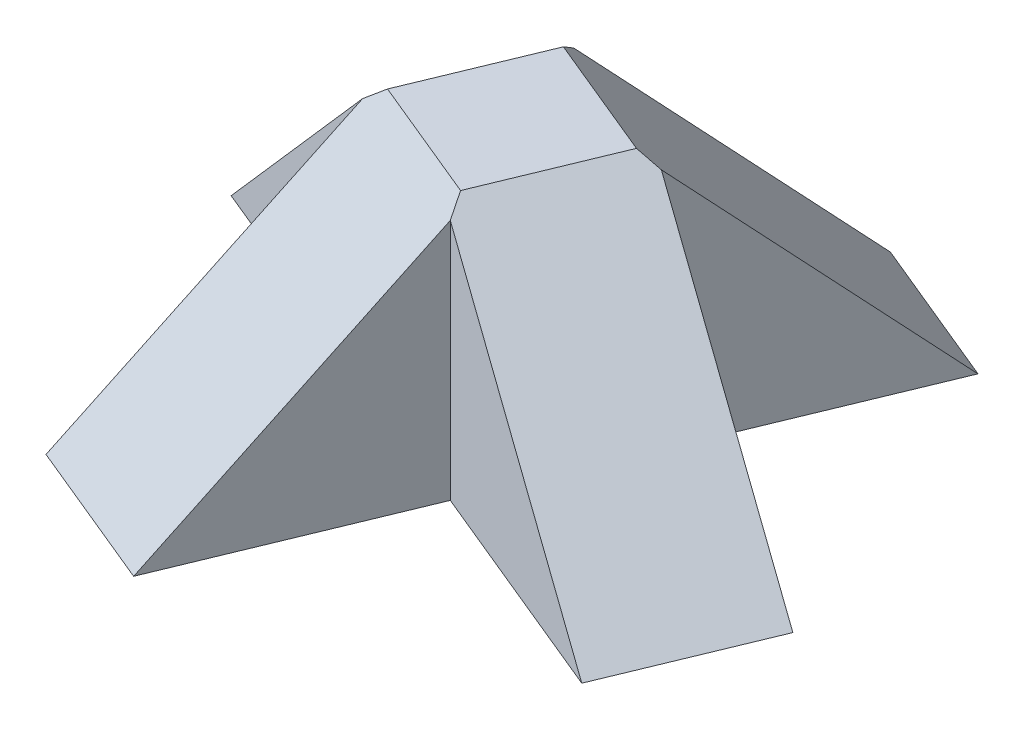
ISO-10303-21;
HEADER;
FILE_DESCRIPTION(('STEP AP214'),'2;1');
FILE_NAME('part.step','',(''),(''),'','','');
FILE_SCHEMA(('AUTOMOTIVE_DESIGN { 1 0 10303 214 1 1 1 1 }'));
ENDSEC;
DATA;
#1=APPLICATION_CONTEXT('core data for automotive mechanical design processes');
#2=APPLICATION_PROTOCOL_DEFINITION('international standard','automotive_design',2000,#1);
#3=PRODUCT_CONTEXT('',#1,'mechanical');
#4=PRODUCT('Part','Part','',(#3));
#5=PRODUCT_RELATED_PRODUCT_CATEGORY('part','',(#4));
#6=PRODUCT_DEFINITION_FORMATION('','',#4);
#7=PRODUCT_DEFINITION_CONTEXT('part definition',#1,'design');
#8=PRODUCT_DEFINITION('design','',#6,#7);
#9=PRODUCT_DEFINITION_SHAPE('','',#8);
#10=(LENGTH_UNIT() NAMED_UNIT(*) SI_UNIT(.MILLI.,.METRE.));
#11=(NAMED_UNIT(*) PLANE_ANGLE_UNIT() SI_UNIT($,.RADIAN.));
#12=(NAMED_UNIT(*) SI_UNIT($,.STERADIAN.) SOLID_ANGLE_UNIT());
#13=UNCERTAINTY_MEASURE_WITH_UNIT(LENGTH_MEASURE(1.E-05),#10,'distance_accuracy_value','');
#14=(GEOMETRIC_REPRESENTATION_CONTEXT(3) GLOBAL_UNCERTAINTY_ASSIGNED_CONTEXT((#13)) GLOBAL_UNIT_ASSIGNED_CONTEXT((#10,
#11,#12)) REPRESENTATION_CONTEXT('',''));
#15=CARTESIAN_POINT('',(0.,0.,0.));
#16=DIRECTION('',(0.,0.,1.));
#17=DIRECTION('',(1.,0.,0.));
#18=AXIS2_PLACEMENT_3D('',#15,#16,#17);
#19=CARTESIAN_POINT('',(93.,-98.95,36.));
#20=DIRECTION('',(0.,1.,0.));
#21=DIRECTION('',(0.,0.,1.));
#22=AXIS2_PLACEMENT_3D('',#19,#20,#21);
#23=PLANE('',#22);
#24=DIRECTION('',(0.924224592734063,-5.10702591323219E-12,0.381849318692014));
#25=VECTOR('',#24,1.);
#26=CARTESIAN_POINT('',(92.6734815221411,-98.9500000000028,36.1355938185074));
#27=LINE('',#26,#25);
#28=CARTESIAN_POINT('',(92.6734815221428,-98.9500000000034,36.1355938185104));
#29=VERTEX_POINT('',#28);
#30=CARTESIAN_POINT('',(93.1355938185099,-98.9500000000021,36.3265184778585));
#31=VERTEX_POINT('',#30);
#32=EDGE_CURVE('E110',#29,#31,#27,.T.);
#33=ORIENTED_EDGE('',*,*,#32,.T.);
#34=DIRECTION('',(-0.381849318692078,5.07927033761673E-12,0.924224592734037));
#35=VECTOR('',#34,1.);
#36=CARTESIAN_POINT('',(93.3265184778551,-98.9500000000054,35.864406181488));
#37=LINE('',#36,#35);
#38=CARTESIAN_POINT('',(93.3265184778585,-98.950000000002,35.8644061814901));
#39=VERTEX_POINT('',#38);
#40=EDGE_CURVE('E20',#39,#31,#37,.T.);
#41=ORIENTED_EDGE('',*,*,#40,.F.);
#42=DIRECTION('',(0.924224592734062,5.10702591323204E-12,0.381849318692016));
#43=VECTOR('',#42,1.);
#44=CARTESIAN_POINT('',(92.864406181488,-98.9500000000054,35.673481522145));
#45=LINE('',#44,#43);
#46=CARTESIAN_POINT('',(92.8644061814896,-98.9500000000034,35.6734815221428));
#47=VERTEX_POINT('',#46);
#48=EDGE_CURVE('E96',#47,#39,#45,.T.);
#49=ORIENTED_EDGE('',*,*,#48,.F.);
#50=DIRECTION('',(-0.381849318692083,-5.05151476200141E-12,0.924224592734035));
#51=VECTOR('',#50,1.);
#52=CARTESIAN_POINT('',(92.8644061814926,-98.9500000000028,35.6734815221411));
#53=LINE('',#52,#51);
#54=EDGE_CURVE('E161',#47,#29,#53,.T.);
#55=ORIENTED_EDGE('',*,*,#54,.T.);
#56=EDGE_LOOP('',(#33,#41,#49,#55));
#57=FACE_BOUND('',#56,.T.);
#58=ADVANCED_FACE('F17',(#57),#23,.T.);
#59=CARTESIAN_POINT('',(93.67006282973,-99.425,36.27684075605));
#60=DIRECTION('',(0.653525476860657,0.707106781189053,0.270008242634382));
#61=DIRECTION('',(-0.734383235407128,0.67873504665146,0.));
#62=AXIS2_PLACEMENT_3D('',#59,#60,#61);
#63=PLANE('',#62);
#64=DIRECTION('',(0.381849318684862,0.,-0.924224592737018));
#65=VECTOR('',#64,1.);
#66=CARTESIAN_POINT('',(93.99451471568,-99.9,36.73548656024));
#67=LINE('',#66,#65);
#68=CARTESIAN_POINT('',(93.9945147156802,-99.9,36.7354865602396));
#69=VERTEX_POINT('',#68);
#70=CARTESIAN_POINT('',(94.2236243068905,-99.8999999999996,36.1809518045998));
#71=VERTEX_POINT('',#70);
#72=EDGE_CURVE('E137',#69,#71,#67,.T.);
#73=ORIENTED_EDGE('',*,*,#72,.T.);
#74=DIRECTION('',(-0.653525476861279,0.707106781188705,-0.270008242633788));
#75=VECTOR('',#74,1.);
#76=CARTESIAN_POINT('',(94.2236243068906,-99.9,36.1809518045986));
#77=LINE('',#76,#75);
#78=CARTESIAN_POINT('',(93.3918221734289,-99.0000000000014,35.8372874177856));
#79=VERTEX_POINT('',#78);
#80=EDGE_CURVE('E91',#71,#79,#77,.T.);
#81=ORIENTED_EDGE('',*,*,#80,.T.);
#82=DIRECTION('',(0.754062124349384,-0.577350269182957,-0.313140510467844));
#83=VECTOR('',#82,1.);
#84=CARTESIAN_POINT('',(93.3265184778589,-98.9500000000028,35.8644061814926));
#85=LINE('',#84,#83);
#86=EDGE_CURVE('E100',#39,#79,#85,.T.);
#87=ORIENTED_EDGE('',*,*,#86,.F.);
#88=ORIENTED_EDGE('',*,*,#40,.T.);
#89=DIRECTION('',(0.313140510450641,-0.577350269197594,0.75406212434532));
#90=VECTOR('',#89,1.);
#91=CARTESIAN_POINT('',(93.135593818512,-98.9500000000054,36.326518477855));
#92=LINE('',#91,#90);
#93=CARTESIAN_POINT('',(93.162712582211,-99.0000000000027,36.3918221734261));
#94=VERTEX_POINT('',#93);
#95=EDGE_CURVE('E147',#31,#94,#92,.T.);
#96=ORIENTED_EDGE('',*,*,#95,.T.);
#97=DIRECTION('',(-0.653525476864632,0.707106781185078,-0.270008242635173));
#98=VECTOR('',#97,1.);
#99=CARTESIAN_POINT('',(93.9945147156806,-99.9,36.7354865602386));
#100=LINE('',#99,#98);
#101=EDGE_CURVE('E139',#69,#94,#100,.T.);
#102=ORIENTED_EDGE('',*,*,#101,.F.);
#103=EDGE_LOOP('',(#73,#81,#87,#88,#96,#102));
#104=FACE_BOUND('',#103,.T.);
#105=ADVANCED_FACE('F112',(#104),#63,.T.);
#106=CARTESIAN_POINT('',(93.80772324016,-99.45,36.00911961119));
#107=DIRECTION('',(-0.381849318686394,0.,0.924224592736385));
#108=DIRECTION('',(0.924224592736385,0.,0.381849318686394));
#109=AXIS2_PLACEMENT_3D('',#106,#107,#108);
#110=PLANE('',#109);
#111=DIRECTION('',(0.,1.,0.));
#112=VECTOR('',#111,1.);
#113=CARTESIAN_POINT('',(93.3918221734194,-99.45,35.8372874177856));
#114=LINE('',#113,#112);
#115=CARTESIAN_POINT('',(93.3918221734288,-99.9,35.8372874177853));
#116=VERTEX_POINT('',#115);
#117=EDGE_CURVE('E106',#79,#116,#114,.F.);
#118=ORIENTED_EDGE('',*,*,#117,.F.);
#119=ORIENTED_EDGE('',*,*,#80,.F.);
#120=DIRECTION('',(-0.92422459273898,0.,-0.381849318680112));
#121=VECTOR('',#120,1.);
#122=CARTESIAN_POINT('',(94.22362430689,-99.9,36.1809518046));
#123=LINE('',#122,#121);
#124=EDGE_CURVE('E132',#71,#116,#123,.T.);
#125=ORIENTED_EDGE('',*,*,#124,.T.);
#126=EDGE_LOOP('',(#118,#119,#125));
#127=FACE_BOUND('',#126,.T.);
#128=ADVANCED_FACE('F136',(#127),#110,.F.);
#129=CARTESIAN_POINT('',(93.56365436683,-99.45,35.42138635105));
#130=DIRECTION('',(0.924224592736385,0.,0.381849318686394));
#131=DIRECTION('',(0.381849318686394,0.,-0.924224592736385));
#132=AXIS2_PLACEMENT_3D('',#129,#130,#131);
#133=PLANE('',#132);
#134=DIRECTION('',(0.381849318676198,0.,-0.924224592740598));
#135=VECTOR('',#134,1.);
#136=CARTESIAN_POINT('',(93.39182217343,-99.9,35.83728741779));
#137=LINE('',#136,#135);
#138=CARTESIAN_POINT('',(93.7354865602393,-99.9,35.0054852843197));
#139=VERTEX_POINT('',#138);
#140=EDGE_CURVE('E124',#116,#139,#137,.T.);
#141=ORIENTED_EDGE('',*,*,#140,.T.);
#142=DIRECTION('',(0.270008242628364,-0.707106781184019,-0.65352547686859));
#143=VECTOR('',#142,1.);
#144=CARTESIAN_POINT('',(93.3918221734295,-99.0000000000013,35.8372874177912));
#145=LINE('',#144,#143);
#146=EDGE_CURVE('E113',#79,#139,#145,.T.);
#147=ORIENTED_EDGE('',*,*,#146,.F.);
#148=ORIENTED_EDGE('',*,*,#117,.T.);
#149=EDGE_LOOP('',(#141,#147,#148));
#150=FACE_BOUND('',#149,.T.);
#151=ADVANCED_FACE('F123',(#150),#133,.T.);
#152=CARTESIAN_POINT('',(93.27684075605,-99.425,35.32993717027));
#153=DIRECTION('',(0.270008242634289,0.707106781189072,-0.653525476860674));
#154=DIRECTION('',(0.,0.678735046651459,0.734383235407128));
#155=AXIS2_PLACEMENT_3D('',#152,#153,#154);
#156=PLANE('',#155);
#157=DIRECTION('',(-0.924224592737023,0.,-0.38184931868485));
#158=VECTOR('',#157,1.);
#159=CARTESIAN_POINT('',(93.73548656024,-99.9,35.00548528432));
#160=LINE('',#159,#158);
#161=CARTESIAN_POINT('',(93.1809518046019,-99.8999999999996,34.7763756931103));
#162=VERTEX_POINT('',#161);
#163=EDGE_CURVE('E134',#139,#162,#160,.T.);
#164=ORIENTED_EDGE('',*,*,#163,.T.);
#165=DIRECTION('',(-0.270008242633789,0.707106781188708,0.653525476861276));
#166=VECTOR('',#165,1.);
#167=CARTESIAN_POINT('',(93.1809518046071,-99.9,34.7763756931129));
#168=LINE('',#167,#166);
#169=CARTESIAN_POINT('',(92.8372874177895,-99.0000000000008,35.6081778265736));
#170=VERTEX_POINT('',#169);
#171=EDGE_CURVE('E115',#162,#170,#168,.T.);
#172=ORIENTED_EDGE('',*,*,#171,.T.);
#173=DIRECTION('',(0.313140510467806,0.577350269182887,0.754062124349453));
#174=VECTOR('',#173,1.);
#175=CARTESIAN_POINT('',(92.8372874177912,-99.0000000000013,35.6081778265705));
#176=LINE('',#175,#174);
#177=EDGE_CURVE('E103',#170,#47,#176,.T.);
#178=ORIENTED_EDGE('',*,*,#177,.T.);
#179=ORIENTED_EDGE('',*,*,#48,.T.);
#180=ORIENTED_EDGE('',*,*,#86,.T.);
#181=ORIENTED_EDGE('',*,*,#146,.T.);
#182=EDGE_LOOP('',(#164,#172,#178,#179,#180,#181));
#183=FACE_BOUND('',#182,.T.);
#184=ADVANCED_FACE('F99',(#183),#156,.T.);
#185=CARTESIAN_POINT('',(93.0091196112,-99.45,35.19227675984));
#186=DIRECTION('',(0.924224592736385,0.,0.381849318686394));
#187=DIRECTION('',(0.381849318686394,0.,-0.924224592736385));
#188=AXIS2_PLACEMENT_3D('',#185,#186,#187);
#189=PLANE('',#188);
#190=DIRECTION('',(0.,1.,0.));
#191=VECTOR('',#190,1.);
#192=CARTESIAN_POINT('',(92.8372874177856,-99.45,35.6081778265806));
#193=LINE('',#192,#191);
#194=CARTESIAN_POINT('',(92.8372874177896,-99.9,35.608177826573));
#195=VERTEX_POINT('',#194);
#196=EDGE_CURVE('E167',#195,#170,#193,.T.);
#197=ORIENTED_EDGE('',*,*,#196,.T.);
#198=ORIENTED_EDGE('',*,*,#171,.F.);
#199=DIRECTION('',(-0.381849318680106,0.,0.924224592738983));
#200=VECTOR('',#199,1.);
#201=CARTESIAN_POINT('',(93.1809518046,-99.9,34.77637569311));
#202=LINE('',#201,#200);
#203=EDGE_CURVE('E172',#162,#195,#202,.T.);
#204=ORIENTED_EDGE('',*,*,#203,.T.);
#205=EDGE_LOOP('',(#197,#198,#204));
#206=FACE_BOUND('',#205,.T.);
#207=ADVANCED_FACE('F171',(#206),#189,.F.);
#208=CARTESIAN_POINT('',(92.42138635105,-99.45,35.43634563317));
#209=DIRECTION('',(-0.381849318686394,0.,0.924224592736385));
#210=DIRECTION('',(0.924224592736385,0.,0.381849318686394));
#211=AXIS2_PLACEMENT_3D('',#208,#209,#210);
#212=PLANE('',#211);
#213=DIRECTION('',(-0.924224592740602,0.,-0.381849318676188));
#214=VECTOR('',#213,1.);
#215=CARTESIAN_POINT('',(92.83728741779,-99.9,35.60817782657));
#216=LINE('',#215,#214);
#217=CARTESIAN_POINT('',(92.0054852843197,-99.9,35.2645134397607));
#218=VERTEX_POINT('',#217);
#219=EDGE_CURVE('E181',#195,#218,#216,.T.);
#220=ORIENTED_EDGE('',*,*,#219,.T.);
#221=DIRECTION('',(0.653525476868564,0.707106781184048,0.270008242628351));
#222=VECTOR('',#221,1.);
#223=CARTESIAN_POINT('',(92.00548528432,-99.9,35.26451343976));
#224=LINE('',#223,#222);
#225=EDGE_CURVE('E164',#218,#170,#224,.T.);
#226=ORIENTED_EDGE('',*,*,#225,.T.);
#227=ORIENTED_EDGE('',*,*,#196,.F.);
#228=EDGE_LOOP('',(#220,#226,#227));
#229=FACE_BOUND('',#228,.T.);
#230=ADVANCED_FACE('F180',(#229),#212,.F.);
#231=CARTESIAN_POINT('',(92.32993717027,-99.425,35.72315924395));
#232=DIRECTION('',(0.653525476860657,-0.707106781189053,0.270008242634382));
#233=DIRECTION('',(0.734383235407128,0.678735046651459,0.));
#234=AXIS2_PLACEMENT_3D('',#231,#232,#233);
#235=PLANE('',#234);
#236=ORIENTED_EDGE('',*,*,#54,.F.);
#237=ORIENTED_EDGE('',*,*,#177,.F.);
#238=ORIENTED_EDGE('',*,*,#225,.F.);
#239=DIRECTION('',(-0.381849318684882,0.,0.92422459273701));
#240=VECTOR('',#239,1.);
#241=CARTESIAN_POINT('',(92.00548528432,-99.9,35.26451343976));
#242=LINE('',#241,#240);
#243=CARTESIAN_POINT('',(91.7763756931103,-99.8999999999996,35.8190481953981));
#244=VERTEX_POINT('',#243);
#245=EDGE_CURVE('E182',#218,#244,#242,.T.);
#246=ORIENTED_EDGE('',*,*,#245,.T.);
#247=DIRECTION('',(-0.653525476861285,-0.7071067811887,-0.270008242633786));
#248=VECTOR('',#247,1.);
#249=CARTESIAN_POINT('',(92.6081778265706,-99.,36.1627125822086));
#250=LINE('',#249,#248);
#251=CARTESIAN_POINT('',(92.6081778265736,-99.0000000000008,36.1627125822105));
#252=VERTEX_POINT('',#251);
#253=EDGE_CURVE('E159',#252,#244,#250,.T.);
#254=ORIENTED_EDGE('',*,*,#253,.F.);
#255=DIRECTION('',(0.754062124349384,0.577350269182957,-0.313140510467844));
#256=VECTOR('',#255,1.);
#257=CARTESIAN_POINT('',(92.6081778265705,-99.0000000000013,36.1627125822088));
#258=LINE('',#257,#256);
#259=EDGE_CURVE('E150',#252,#29,#258,.T.);
#260=ORIENTED_EDGE('',*,*,#259,.T.);
#261=EDGE_LOOP('',(#236,#237,#238,#246,#254,#260));
#262=FACE_BOUND('',#261,.T.);
#263=ADVANCED_FACE('F177',(#262),#235,.F.);
#264=CARTESIAN_POINT('',(92.19227675984,-99.45,35.9908803888));
#265=DIRECTION('',(-0.381849318686394,0.,0.924224592736385));
#266=DIRECTION('',(0.924224592736385,0.,0.381849318686394));
#267=AXIS2_PLACEMENT_3D('',#264,#265,#266);
#268=PLANE('',#267);
#269=DIRECTION('',(0.,1.,0.));
#270=VECTOR('',#269,1.);
#271=CARTESIAN_POINT('',(92.6081778265806,-99.45,36.1627125822144));
#272=LINE('',#271,#270);
#273=CARTESIAN_POINT('',(92.608177826573,-99.9,36.1627125822104));
#274=VERTEX_POINT('',#273);
#275=EDGE_CURVE('E156',#274,#252,#272,.T.);
#276=ORIENTED_EDGE('',*,*,#275,.T.);
#277=ORIENTED_EDGE('',*,*,#253,.T.);
#278=DIRECTION('',(0.924224592738983,0.,0.381849318680107));
#279=VECTOR('',#278,1.);
#280=CARTESIAN_POINT('',(91.77637569311,-99.9,35.8190481954));
#281=LINE('',#280,#279);
#282=EDGE_CURVE('E184',#244,#274,#281,.T.);
#283=ORIENTED_EDGE('',*,*,#282,.T.);
#284=EDGE_LOOP('',(#276,#277,#283));
#285=FACE_BOUND('',#284,.T.);
#286=ADVANCED_FACE('F209',(#285),#268,.T.);
#287=CARTESIAN_POINT('',(92.43634563317,-99.45,36.57861364895));
#288=DIRECTION('',(0.924224592736385,0.,0.381849318686394));
#289=DIRECTION('',(0.381849318686394,0.,-0.924224592736385));
#290=AXIS2_PLACEMENT_3D('',#287,#288,#289);
#291=PLANE('',#290);
#292=DIRECTION('',(-0.381849318676198,0.,0.924224592740598));
#293=VECTOR('',#292,1.);
#294=CARTESIAN_POINT('',(92.60817782657,-99.9,36.16271258221));
#295=LINE('',#294,#293);
#296=CARTESIAN_POINT('',(92.2645134397607,-99.9,36.9945147156803));
#297=VERTEX_POINT('',#296);
#298=EDGE_CURVE('E190',#274,#297,#295,.T.);
#299=ORIENTED_EDGE('',*,*,#298,.T.);
#300=DIRECTION('',(0.270008242628364,0.707106781184019,-0.65352547686859));
#301=VECTOR('',#300,1.);
#302=CARTESIAN_POINT('',(92.26451343976,-99.9,36.99451471568));
#303=LINE('',#302,#301);
#304=EDGE_CURVE('E153',#297,#252,#303,.T.);
#305=ORIENTED_EDGE('',*,*,#304,.T.);
#306=ORIENTED_EDGE('',*,*,#275,.F.);
#307=EDGE_LOOP('',(#299,#305,#306));
#308=FACE_BOUND('',#307,.T.);
#309=ADVANCED_FACE('F206',(#308),#291,.F.);
#310=CARTESIAN_POINT('',(92.72315924395,-99.425,36.67006282973));
#311=DIRECTION('',(0.270008242634289,-0.707106781189073,-0.653525476860674));
#312=DIRECTION('',(0.,0.678735046651459,-0.734383235407128));
#313=AXIS2_PLACEMENT_3D('',#310,#311,#312);
#314=PLANE('',#313);
#315=ORIENTED_EDGE('',*,*,#32,.F.);
#316=ORIENTED_EDGE('',*,*,#259,.F.);
#317=ORIENTED_EDGE('',*,*,#304,.F.);
#318=DIRECTION('',(0.92422459273702,0.,0.381849318684858));
#319=VECTOR('',#318,1.);
#320=CARTESIAN_POINT('',(92.26451343976,-99.9,36.99451471568));
#321=LINE('',#320,#319);
#322=CARTESIAN_POINT('',(92.8190481953981,-99.8999999999996,37.2236243068897));
#323=VERTEX_POINT('',#322);
#324=EDGE_CURVE('E193',#297,#323,#321,.T.);
#325=ORIENTED_EDGE('',*,*,#324,.T.);
#326=DIRECTION('',(-0.270008242633788,-0.707106781188705,0.653525476861279));
#327=VECTOR('',#326,1.);
#328=CARTESIAN_POINT('',(93.1627125822086,-99.,36.3918221734294));
#329=LINE('',#328,#327);
#330=EDGE_CURVE('E145',#94,#323,#329,.T.);
#331=ORIENTED_EDGE('',*,*,#330,.F.);
#332=ORIENTED_EDGE('',*,*,#95,.F.);
#333=EDGE_LOOP('',(#315,#316,#317,#325,#331,#332));
#334=FACE_BOUND('',#333,.T.);
#335=ADVANCED_FACE('F203',(#334),#314,.F.);
#336=CARTESIAN_POINT('',(92.9908803888,-99.45,36.80772324016));
#337=DIRECTION('',(0.924224592736385,0.,0.381849318686394));
#338=DIRECTION('',(0.381849318686394,0.,-0.924224592736385));
#339=AXIS2_PLACEMENT_3D('',#336,#337,#338);
#340=PLANE('',#339);
#341=DIRECTION('',(0.,1.,0.));
#342=VECTOR('',#341,1.);
#343=CARTESIAN_POINT('',(93.1627125822144,-99.45,36.3918221734194));
#344=LINE('',#343,#342);
#345=CARTESIAN_POINT('',(93.1627125822104,-99.9,36.391822173427));
#346=VERTEX_POINT('',#345);
#347=EDGE_CURVE('E34',#94,#346,#344,.F.);
#348=ORIENTED_EDGE('',*,*,#347,.F.);
#349=ORIENTED_EDGE('',*,*,#330,.T.);
#350=DIRECTION('',(0.381849318680119,0.,-0.924224592738978));
#351=VECTOR('',#350,1.);
#352=CARTESIAN_POINT('',(92.8190481954,-99.9,37.22362430689));
#353=LINE('',#352,#351);
#354=EDGE_CURVE('E26',#323,#346,#353,.T.);
#355=ORIENTED_EDGE('',*,*,#354,.T.);
#356=EDGE_LOOP('',(#348,#349,#355));
#357=FACE_BOUND('',#356,.T.);
#358=ADVANCED_FACE('F198',(#357),#340,.T.);
#359=CARTESIAN_POINT('',(93.57861364895,-99.45,36.56365436683));
#360=DIRECTION('',(-0.381849318686394,0.,0.924224592736385));
#361=DIRECTION('',(0.924224592736385,0.,0.381849318686394));
#362=AXIS2_PLACEMENT_3D('',#359,#360,#361);
#363=PLANE('',#362);
#364=DIRECTION('',(0.924224592740602,0.,0.381849318676188));
#365=VECTOR('',#364,1.);
#366=CARTESIAN_POINT('',(93.16271258221,-99.9,36.39182217343));
#367=LINE('',#366,#365);
#368=EDGE_CURVE('E11',#346,#69,#367,.T.);
#369=ORIENTED_EDGE('',*,*,#368,.T.);
#370=ORIENTED_EDGE('',*,*,#101,.T.);
#371=ORIENTED_EDGE('',*,*,#347,.T.);
#372=EDGE_LOOP('',(#369,#370,#371));
#373=FACE_BOUND('',#372,.T.);
#374=ADVANCED_FACE('F220',(#373),#363,.T.);
#375=CARTESIAN_POINT('',(93.,-99.9,36.));
#376=DIRECTION('',(0.,1.,0.));
#377=DIRECTION('',(0.,0.,1.));
#378=AXIS2_PLACEMENT_3D('',#375,#376,#377);
#379=PLANE('',#378);
#380=ORIENTED_EDGE('',*,*,#354,.F.);
#381=ORIENTED_EDGE('',*,*,#324,.F.);
#382=ORIENTED_EDGE('',*,*,#298,.F.);
#383=ORIENTED_EDGE('',*,*,#282,.F.);
#384=ORIENTED_EDGE('',*,*,#245,.F.);
#385=ORIENTED_EDGE('',*,*,#219,.F.);
#386=ORIENTED_EDGE('',*,*,#203,.F.);
#387=ORIENTED_EDGE('',*,*,#163,.F.);
#388=ORIENTED_EDGE('',*,*,#140,.F.);
#389=ORIENTED_EDGE('',*,*,#124,.F.);
#390=ORIENTED_EDGE('',*,*,#72,.F.);
#391=ORIENTED_EDGE('',*,*,#368,.F.);
#392=EDGE_LOOP('',(#380,#381,#382,#383,#384,#385,#386,#387,#388,#389,#390,#391));
#393=FACE_BOUND('',#392,.T.);
#394=ADVANCED_FACE('F131',(#393),#379,.F.);
#395=CLOSED_SHELL('',(#58,#105,#128,#151,#184,#207,#230,#263,#286,#309,#335,#358,#374,#394));
#396=MANIFOLD_SOLID_BREP('B1',#395);
#397=ADVANCED_BREP_SHAPE_REPRESENTATION('',(#18,#396),#14);
#398=SHAPE_DEFINITION_REPRESENTATION(#9,#397);
ENDSEC;
END-ISO-10303-21;
